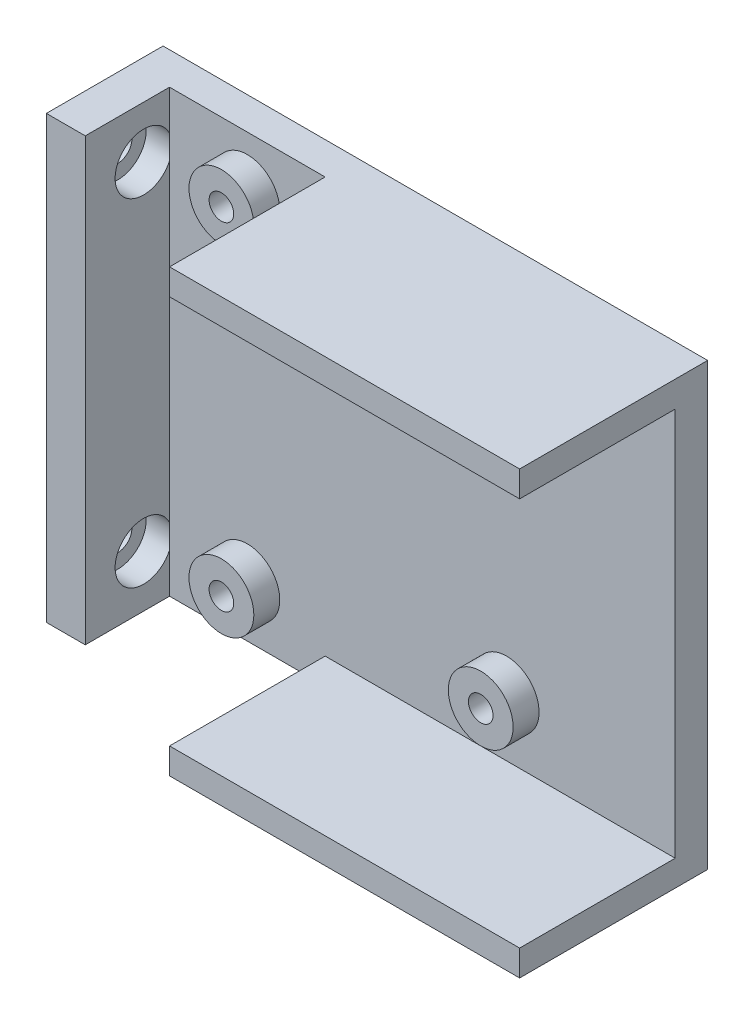
ISO-10303-21;
HEADER;
FILE_DESCRIPTION(('STEP AP214'),'2;1');
FILE_NAME('part.step','',(''),(''),'','','');
FILE_SCHEMA(('AUTOMOTIVE_DESIGN { 1 0 10303 214 1 1 1 1 }'));
ENDSEC;
DATA;
#1=APPLICATION_CONTEXT('core data for automotive mechanical design processes');
#2=APPLICATION_PROTOCOL_DEFINITION('international standard','automotive_design',2000,#1);
#3=PRODUCT_CONTEXT('',#1,'mechanical');
#4=PRODUCT('Part','Part','',(#3));
#5=PRODUCT_RELATED_PRODUCT_CATEGORY('part','',(#4));
#6=PRODUCT_DEFINITION_FORMATION('','',#4);
#7=PRODUCT_DEFINITION_CONTEXT('part definition',#1,'design');
#8=PRODUCT_DEFINITION('design','',#6,#7);
#9=PRODUCT_DEFINITION_SHAPE('','',#8);
#10=(LENGTH_UNIT() NAMED_UNIT(*) SI_UNIT(.MILLI.,.METRE.));
#11=(NAMED_UNIT(*) PLANE_ANGLE_UNIT() SI_UNIT($,.RADIAN.));
#12=(NAMED_UNIT(*) SI_UNIT($,.STERADIAN.) SOLID_ANGLE_UNIT());
#13=UNCERTAINTY_MEASURE_WITH_UNIT(LENGTH_MEASURE(1.E-05),#10,'distance_accuracy_value','');
#14=(GEOMETRIC_REPRESENTATION_CONTEXT(3) GLOBAL_UNCERTAINTY_ASSIGNED_CONTEXT((#13)) GLOBAL_UNIT_ASSIGNED_CONTEXT((#10,
#11,#12)) REPRESENTATION_CONTEXT('',''));
#15=CARTESIAN_POINT('',(0.,0.,0.));
#16=DIRECTION('',(0.,0.,1.));
#17=DIRECTION('',(1.,0.,0.));
#18=AXIS2_PLACEMENT_3D('',#15,#16,#17);
#19=CARTESIAN_POINT('',(0.,0.,14.5));
#20=DIRECTION('',(0.,0.,-1.));
#21=DIRECTION('',(-1.,0.,0.));
#22=AXIS2_PLACEMENT_3D('',#19,#20,#21);
#23=PLANE('',#22);
#24=DIRECTION('',(-1.,0.,0.));
#25=VECTOR('',#24,1.);
#26=CARTESIAN_POINT('',(3.,2.,14.5));
#27=LINE('',#26,#25);
#28=CARTESIAN_POINT('',(42.,2.,14.5));
#29=VERTEX_POINT('',#28);
#30=CARTESIAN_POINT('',(15.,2.,14.5));
#31=VERTEX_POINT('',#30);
#32=EDGE_CURVE('E299',#29,#31,#27,.T.);
#33=ORIENTED_EDGE('',*,*,#32,.T.);
#34=DIRECTION('',(0.,1.,0.));
#35=VECTOR('',#34,1.);
#36=CARTESIAN_POINT('',(15.,0.,14.5));
#37=LINE('',#36,#35);
#38=CARTESIAN_POINT('',(15.,0.,14.5));
#39=VERTEX_POINT('',#38);
#40=EDGE_CURVE('E275',#39,#31,#37,.T.);
#41=ORIENTED_EDGE('',*,*,#40,.F.);
#42=DIRECTION('',(1.,0.,0.));
#43=VECTOR('',#42,1.);
#44=CARTESIAN_POINT('',(42.,0.,14.5));
#45=LINE('',#44,#43);
#46=CARTESIAN_POINT('',(42.,0.,14.5));
#47=VERTEX_POINT('',#46);
#48=EDGE_CURVE('E202',#39,#47,#45,.T.);
#49=ORIENTED_EDGE('',*,*,#48,.T.);
#50=DIRECTION('',(0.,1.,0.));
#51=VECTOR('',#50,1.);
#52=CARTESIAN_POINT('',(42.,2.,14.5));
#53=LINE('',#52,#51);
#54=EDGE_CURVE('E205',#47,#29,#53,.T.);
#55=ORIENTED_EDGE('',*,*,#54,.T.);
#56=EDGE_LOOP('',(#33,#41,#49,#55));
#57=FACE_BOUND('',#56,.T.);
#58=ADVANCED_FACE('F35',(#57),#23,.F.);
#59=DIRECTION('',(-1.,0.,0.));
#60=VECTOR('',#59,1.);
#61=CARTESIAN_POINT('',(0.,34.,14.5));
#62=LINE('',#61,#60);
#63=CARTESIAN_POINT('',(42.,34.,14.5));
#64=VERTEX_POINT('',#63);
#65=CARTESIAN_POINT('',(15.,34.,14.5));
#66=VERTEX_POINT('',#65);
#67=EDGE_CURVE('E216',#64,#66,#62,.T.);
#68=ORIENTED_EDGE('',*,*,#67,.T.);
#69=DIRECTION('',(0.,-1.,0.));
#70=VECTOR('',#69,1.);
#71=CARTESIAN_POINT('',(15.,0.,14.5));
#72=LINE('',#71,#70);
#73=CARTESIAN_POINT('',(15.,32.,14.5));
#74=VERTEX_POINT('',#73);
#75=EDGE_CURVE('E169',#66,#74,#72,.T.);
#76=ORIENTED_EDGE('',*,*,#75,.T.);
#77=DIRECTION('',(1.,0.,0.));
#78=VECTOR('',#77,1.);
#79=CARTESIAN_POINT('',(42.,32.,14.5));
#80=LINE('',#79,#78);
#81=CARTESIAN_POINT('',(42.,32.,14.5));
#82=VERTEX_POINT('',#81);
#83=EDGE_CURVE('E302',#74,#82,#80,.T.);
#84=ORIENTED_EDGE('',*,*,#83,.T.);
#85=DIRECTION('',(0.,1.,0.));
#86=VECTOR('',#85,1.);
#87=CARTESIAN_POINT('',(42.,34.,14.5));
#88=LINE('',#87,#86);
#89=EDGE_CURVE('E304',#82,#64,#88,.T.);
#90=ORIENTED_EDGE('',*,*,#89,.T.);
#91=EDGE_LOOP('',(#68,#76,#84,#90));
#92=FACE_BOUND('',#91,.T.);
#93=ADVANCED_FACE('F185',(#92),#23,.F.);
#94=CARTESIAN_POINT('',(0.,0.,2.5));
#95=DIRECTION('',(0.,0.,-1.));
#96=DIRECTION('',(-1.,0.,0.));
#97=AXIS2_PLACEMENT_3D('',#94,#95,#96);
#98=PLANE('',#97);
#99=CARTESIAN_POINT('',(29.,6.5,2.5));
#100=DIRECTION('',(0.,0.,-1.));
#101=DIRECTION('',(-1.,0.,0.));
#102=AXIS2_PLACEMENT_3D('',#99,#100,#101);
#103=CIRCLE('',#102,2.5);
#104=CARTESIAN_POINT('',(26.5,6.5,2.5));
#105=VERTEX_POINT('',#104);
#106=EDGE_CURVE('E12',#105,#105,#103,.F.);
#107=ORIENTED_EDGE('',*,*,#106,.F.);
#108=EDGE_LOOP('',(#107));
#109=FACE_BOUND('',#108,.T.);
#110=CARTESIAN_POINT('',(29.,27.5,2.5));
#111=DIRECTION('',(0.,0.,-1.));
#112=DIRECTION('',(-1.,0.,0.));
#113=AXIS2_PLACEMENT_3D('',#110,#111,#112);
#114=CIRCLE('',#113,2.5);
#115=CARTESIAN_POINT('',(26.5,27.5,2.5));
#116=VERTEX_POINT('',#115);
#117=EDGE_CURVE('E43',#116,#116,#114,.F.);
#118=ORIENTED_EDGE('',*,*,#117,.F.);
#119=EDGE_LOOP('',(#118));
#120=FACE_BOUND('',#119,.T.);
#121=CARTESIAN_POINT('',(9.00000000000001,4.,2.5));
#122=DIRECTION('',(0.,0.,-1.));
#123=DIRECTION('',(-1.,0.,0.));
#124=AXIS2_PLACEMENT_3D('',#121,#122,#123);
#125=CIRCLE('',#124,2.5);
#126=CARTESIAN_POINT('',(6.5,4.,2.5));
#127=VERTEX_POINT('',#126);
#128=EDGE_CURVE('E175',#127,#127,#125,.F.);
#129=ORIENTED_EDGE('',*,*,#128,.F.);
#130=EDGE_LOOP('',(#129));
#131=FACE_BOUND('',#130,.T.);
#132=CARTESIAN_POINT('',(9.,30.,2.5));
#133=DIRECTION('',(0.,0.,-1.));
#134=DIRECTION('',(-1.,0.,0.));
#135=AXIS2_PLACEMENT_3D('',#132,#133,#134);
#136=CIRCLE('',#135,2.5);
#137=CARTESIAN_POINT('',(6.5,30.,2.5));
#138=VERTEX_POINT('',#137);
#139=EDGE_CURVE('E172',#138,#138,#136,.F.);
#140=ORIENTED_EDGE('',*,*,#139,.F.);
#141=EDGE_LOOP('',(#140));
#142=FACE_BOUND('',#141,.T.);
#143=DIRECTION('',(1.,0.,0.));
#144=VECTOR('',#143,1.);
#145=CARTESIAN_POINT('',(42.,32.,2.5));
#146=LINE('',#145,#144);
#147=CARTESIAN_POINT('',(15.,32.,2.5));
#148=VERTEX_POINT('',#147);
#149=CARTESIAN_POINT('',(42.,32.,2.5));
#150=VERTEX_POINT('',#149);
#151=EDGE_CURVE('E193',#148,#150,#146,.T.);
#152=ORIENTED_EDGE('',*,*,#151,.F.);
#153=DIRECTION('',(0.,1.,0.));
#154=VECTOR('',#153,1.);
#155=CARTESIAN_POINT('',(15.,0.,2.5));
#156=LINE('',#155,#154);
#157=CARTESIAN_POINT('',(15.,34.,2.5));
#158=VERTEX_POINT('',#157);
#159=EDGE_CURVE('E195',#148,#158,#156,.T.);
#160=ORIENTED_EDGE('',*,*,#159,.T.);
#161=DIRECTION('',(-1.,0.,0.));
#162=VECTOR('',#161,1.);
#163=CARTESIAN_POINT('',(3.,34.,2.5));
#164=LINE('',#163,#162);
#165=CARTESIAN_POINT('',(3.,34.,2.5));
#166=VERTEX_POINT('',#165);
#167=EDGE_CURVE('E281',#158,#166,#164,.T.);
#168=ORIENTED_EDGE('',*,*,#167,.T.);
#169=DIRECTION('',(0.,1.,0.));
#170=VECTOR('',#169,1.);
#171=CARTESIAN_POINT('',(3.,32.,2.5));
#172=LINE('',#171,#170);
#173=CARTESIAN_POINT('',(3.,30.9165151389912,2.5));
#174=VERTEX_POINT('',#173);
#175=EDGE_CURVE('E210',#174,#166,#172,.T.);
#176=ORIENTED_EDGE('',*,*,#175,.F.);
#177=CARTESIAN_POINT('',(3.,29.0834848610088,2.5));
#178=VERTEX_POINT('',#177);
#179=EDGE_CURVE('E308',#178,#174,#172,.T.);
#180=ORIENTED_EDGE('',*,*,#179,.F.);
#181=CARTESIAN_POINT('',(3.,4.91651513899117,2.5));
#182=VERTEX_POINT('',#181);
#183=EDGE_CURVE('E312',#182,#178,#172,.T.);
#184=ORIENTED_EDGE('',*,*,#183,.F.);
#185=CARTESIAN_POINT('',(3.,3.08348486100883,2.5));
#186=VERTEX_POINT('',#185);
#187=EDGE_CURVE('E208',#186,#182,#172,.T.);
#188=ORIENTED_EDGE('',*,*,#187,.F.);
#189=CARTESIAN_POINT('',(3.,0.,2.5));
#190=VERTEX_POINT('',#189);
#191=EDGE_CURVE('E203',#190,#186,#172,.T.);
#192=ORIENTED_EDGE('',*,*,#191,.F.);
#193=DIRECTION('',(1.,0.,0.));
#194=VECTOR('',#193,1.);
#195=CARTESIAN_POINT('',(3.,0.,2.5));
#196=LINE('',#195,#194);
#197=CARTESIAN_POINT('',(15.,0.,2.5));
#198=VERTEX_POINT('',#197);
#199=EDGE_CURVE('E277',#190,#198,#196,.T.);
#200=ORIENTED_EDGE('',*,*,#199,.T.);
#201=CARTESIAN_POINT('',(15.,2.,2.5));
#202=VERTEX_POINT('',#201);
#203=EDGE_CURVE('E285',#198,#202,#156,.T.);
#204=ORIENTED_EDGE('',*,*,#203,.T.);
#205=DIRECTION('',(-1.,0.,0.));
#206=VECTOR('',#205,1.);
#207=CARTESIAN_POINT('',(3.,2.,2.5));
#208=LINE('',#207,#206);
#209=CARTESIAN_POINT('',(42.,2.,2.5));
#210=VERTEX_POINT('',#209);
#211=EDGE_CURVE('E296',#210,#202,#208,.T.);
#212=ORIENTED_EDGE('',*,*,#211,.F.);
#213=DIRECTION('',(0.,1.,0.));
#214=VECTOR('',#213,1.);
#215=CARTESIAN_POINT('',(42.,0.,2.5));
#216=LINE('',#215,#214);
#217=EDGE_CURVE('E157',#210,#150,#216,.T.);
#218=ORIENTED_EDGE('',*,*,#217,.T.);
#219=EDGE_LOOP('',(#152,#160,#168,#176,#180,#184,#188,#192,#200,#204,#212,#218));
#220=FACE_BOUND('',#219,.T.);
#221=ADVANCED_FACE('F182',(#109,#120,#131,#142,#220),#98,.F.);
#222=CARTESIAN_POINT('',(0.,0.,2.5));
#223=DIRECTION('',(1.,0.,0.));
#224=DIRECTION('',(0.,0.,-1.));
#225=AXIS2_PLACEMENT_3D('',#222,#223,#224);
#226=PLANE('',#225);
#227=CARTESIAN_POINT('',(0.,30.,4.5));
#228=DIRECTION('',(1.,0.,0.));
#229=DIRECTION('',(0.,0.,-1.));
#230=AXIS2_PLACEMENT_3D('',#227,#228,#229);
#231=CIRCLE('',#230,1.1);
#232=CARTESIAN_POINT('',(0.,30.,3.4));
#233=VERTEX_POINT('',#232);
#234=EDGE_CURVE('E259',#233,#233,#231,.T.);
#235=ORIENTED_EDGE('',*,*,#234,.T.);
#236=EDGE_LOOP('',(#235));
#237=FACE_BOUND('',#236,.T.);
#238=CARTESIAN_POINT('',(0.,4.,4.5));
#239=DIRECTION('',(1.,0.,0.));
#240=DIRECTION('',(0.,0.,-1.));
#241=AXIS2_PLACEMENT_3D('',#238,#239,#240);
#242=CIRCLE('',#241,1.1);
#243=CARTESIAN_POINT('',(0.,4.,3.4));
#244=VERTEX_POINT('',#243);
#245=EDGE_CURVE('E272',#244,#244,#242,.T.);
#246=ORIENTED_EDGE('',*,*,#245,.T.);
#247=EDGE_LOOP('',(#246));
#248=FACE_BOUND('',#247,.T.);
#249=DIRECTION('',(0.,0.,-1.));
#250=VECTOR('',#249,1.);
#251=CARTESIAN_POINT('',(0.,0.,2.5));
#252=LINE('',#251,#250);
#253=CARTESIAN_POINT('',(0.,0.,9.));
#254=VERTEX_POINT('',#253);
#255=CARTESIAN_POINT('',(0.,0.,0.));
#256=VERTEX_POINT('',#255);
#257=EDGE_CURVE('E149',#254,#256,#252,.T.);
#258=ORIENTED_EDGE('',*,*,#257,.F.);
#259=DIRECTION('',(0.,-1.,0.));
#260=VECTOR('',#259,1.);
#261=CARTESIAN_POINT('',(0.,34.,9.));
#262=LINE('',#261,#260);
#263=CARTESIAN_POINT('',(0.,34.,9.));
#264=VERTEX_POINT('',#263);
#265=EDGE_CURVE('E137',#264,#254,#262,.T.);
#266=ORIENTED_EDGE('',*,*,#265,.F.);
#267=DIRECTION('',(0.,0.,-1.));
#268=VECTOR('',#267,1.);
#269=CARTESIAN_POINT('',(0.,34.,2.5));
#270=LINE('',#269,#268);
#271=CARTESIAN_POINT('',(0.,34.,0.));
#272=VERTEX_POINT('',#271);
#273=EDGE_CURVE('E147',#264,#272,#270,.T.);
#274=ORIENTED_EDGE('',*,*,#273,.T.);
#275=DIRECTION('',(0.,-1.,0.));
#276=VECTOR('',#275,1.);
#277=CARTESIAN_POINT('',(0.,0.,0.));
#278=LINE('',#277,#276);
#279=EDGE_CURVE('E218',#272,#256,#278,.T.);
#280=ORIENTED_EDGE('',*,*,#279,.T.);
#281=EDGE_LOOP('',(#258,#266,#274,#280));
#282=FACE_BOUND('',#281,.T.);
#283=ADVANCED_FACE('F37',(#237,#248,#282),#226,.F.);
#284=CARTESIAN_POINT('',(0.,0.,2.5));
#285=DIRECTION('',(0.,1.,0.));
#286=DIRECTION('',(0.,0.,1.));
#287=AXIS2_PLACEMENT_3D('',#284,#285,#286);
#288=PLANE('',#287);
#289=DIRECTION('',(0.,0.,1.));
#290=VECTOR('',#289,1.);
#291=CARTESIAN_POINT('',(3.,0.,-33.5555127546399));
#292=LINE('',#291,#290);
#293=CARTESIAN_POINT('',(3.,0.,9.));
#294=VERTEX_POINT('',#293);
#295=EDGE_CURVE('E242',#190,#294,#292,.T.);
#296=ORIENTED_EDGE('',*,*,#295,.T.);
#297=DIRECTION('',(1.,0.,0.));
#298=VECTOR('',#297,1.);
#299=CARTESIAN_POINT('',(0.,0.,9.));
#300=LINE('',#299,#298);
#301=EDGE_CURVE('E50',#254,#294,#300,.T.);
#302=ORIENTED_EDGE('',*,*,#301,.F.);
#303=ORIENTED_EDGE('',*,*,#257,.T.);
#304=DIRECTION('',(1.,0.,0.));
#305=VECTOR('',#304,1.);
#306=CARTESIAN_POINT('',(0.,0.,0.));
#307=LINE('',#306,#305);
#308=CARTESIAN_POINT('',(42.,0.,0.));
#309=VERTEX_POINT('',#308);
#310=EDGE_CURVE('E221',#256,#309,#307,.T.);
#311=ORIENTED_EDGE('',*,*,#310,.T.);
#312=DIRECTION('',(0.,0.,-1.));
#313=VECTOR('',#312,1.);
#314=CARTESIAN_POINT('',(42.,0.,2.5));
#315=LINE('',#314,#313);
#316=EDGE_CURVE('E159',#47,#309,#315,.T.);
#317=ORIENTED_EDGE('',*,*,#316,.F.);
#318=ORIENTED_EDGE('',*,*,#48,.F.);
#319=DIRECTION('',(0.,0.,1.));
#320=VECTOR('',#319,1.);
#321=CARTESIAN_POINT('',(15.,0.,-33.5555127546399));
#322=LINE('',#321,#320);
#323=EDGE_CURVE('E280',#198,#39,#322,.T.);
#324=ORIENTED_EDGE('',*,*,#323,.F.);
#325=ORIENTED_EDGE('',*,*,#199,.F.);
#326=EDGE_LOOP('',(#296,#302,#303,#311,#317,#318,#324,#325));
#327=FACE_BOUND('',#326,.T.);
#328=ADVANCED_FACE('F238',(#327),#288,.F.);
#329=CARTESIAN_POINT('',(42.,0.,2.5));
#330=DIRECTION('',(-1.,0.,0.));
#331=DIRECTION('',(0.,0.,1.));
#332=AXIS2_PLACEMENT_3D('',#329,#330,#331);
#333=PLANE('',#332);
#334=DIRECTION('',(0.,1.,0.));
#335=VECTOR('',#334,1.);
#336=CARTESIAN_POINT('',(42.,0.,0.));
#337=LINE('',#336,#335);
#338=CARTESIAN_POINT('',(42.,34.,0.));
#339=VERTEX_POINT('',#338);
#340=EDGE_CURVE('E222',#309,#339,#337,.T.);
#341=ORIENTED_EDGE('',*,*,#340,.T.);
#342=DIRECTION('',(0.,0.,-1.));
#343=VECTOR('',#342,1.);
#344=CARTESIAN_POINT('',(42.,34.,2.5));
#345=LINE('',#344,#343);
#346=EDGE_CURVE('E156',#64,#339,#345,.T.);
#347=ORIENTED_EDGE('',*,*,#346,.F.);
#348=ORIENTED_EDGE('',*,*,#89,.F.);
#349=DIRECTION('',(0.,0.,-1.));
#350=VECTOR('',#349,1.);
#351=CARTESIAN_POINT('',(42.,32.,14.5));
#352=LINE('',#351,#350);
#353=EDGE_CURVE('E213',#82,#150,#352,.T.);
#354=ORIENTED_EDGE('',*,*,#353,.T.);
#355=ORIENTED_EDGE('',*,*,#217,.F.);
#356=DIRECTION('',(0.,0.,-1.));
#357=VECTOR('',#356,1.);
#358=CARTESIAN_POINT('',(42.,2.,14.5));
#359=LINE('',#358,#357);
#360=EDGE_CURVE('E215',#29,#210,#359,.T.);
#361=ORIENTED_EDGE('',*,*,#360,.F.);
#362=ORIENTED_EDGE('',*,*,#54,.F.);
#363=ORIENTED_EDGE('',*,*,#316,.T.);
#364=EDGE_LOOP('',(#341,#347,#348,#354,#355,#361,#362,#363));
#365=FACE_BOUND('',#364,.T.);
#366=ADVANCED_FACE('F225',(#365),#333,.F.);
#367=CARTESIAN_POINT('',(0.,34.,2.5));
#368=DIRECTION('',(0.,-1.,0.));
#369=DIRECTION('',(0.,0.,-1.));
#370=AXIS2_PLACEMENT_3D('',#367,#368,#369);
#371=PLANE('',#370);
#372=ORIENTED_EDGE('',*,*,#273,.F.);
#373=DIRECTION('',(-1.,0.,0.));
#374=VECTOR('',#373,1.);
#375=CARTESIAN_POINT('',(3.,34.,9.));
#376=LINE('',#375,#374);
#377=CARTESIAN_POINT('',(3.,34.,9.));
#378=VERTEX_POINT('',#377);
#379=EDGE_CURVE('E134',#378,#264,#376,.T.);
#380=ORIENTED_EDGE('',*,*,#379,.F.);
#381=DIRECTION('',(0.,0.,1.));
#382=VECTOR('',#381,1.);
#383=CARTESIAN_POINT('',(3.,34.,-33.5555127546399));
#384=LINE('',#383,#382);
#385=EDGE_CURVE('E283',#166,#378,#384,.T.);
#386=ORIENTED_EDGE('',*,*,#385,.F.);
#387=ORIENTED_EDGE('',*,*,#167,.F.);
#388=DIRECTION('',(0.,0.,1.));
#389=VECTOR('',#388,1.);
#390=CARTESIAN_POINT('',(15.,34.,-33.5555127546399));
#391=LINE('',#390,#389);
#392=EDGE_CURVE('E284',#158,#66,#391,.T.);
#393=ORIENTED_EDGE('',*,*,#392,.T.);
#394=ORIENTED_EDGE('',*,*,#67,.F.);
#395=ORIENTED_EDGE('',*,*,#346,.T.);
#396=DIRECTION('',(-1.,0.,0.));
#397=VECTOR('',#396,1.);
#398=CARTESIAN_POINT('',(0.,34.,0.));
#399=LINE('',#398,#397);
#400=EDGE_CURVE('E154',#339,#272,#399,.T.);
#401=ORIENTED_EDGE('',*,*,#400,.T.);
#402=EDGE_LOOP('',(#372,#380,#386,#387,#393,#394,#395,#401));
#403=FACE_BOUND('',#402,.T.);
#404=ADVANCED_FACE('F151',(#403),#371,.F.);
#405=CARTESIAN_POINT('',(0.,0.,0.));
#406=DIRECTION('',(0.,0.,-1.));
#407=DIRECTION('',(-1.,0.,0.));
#408=AXIS2_PLACEMENT_3D('',#405,#406,#407);
#409=PLANE('',#408);
#410=CARTESIAN_POINT('',(9.,30.,0.));
#411=DIRECTION('',(0.,0.,-1.));
#412=DIRECTION('',(-1.,0.,0.));
#413=AXIS2_PLACEMENT_3D('',#410,#411,#412);
#414=CIRCLE('',#413,0.949999999999999);
#415=CARTESIAN_POINT('',(8.05,30.,0.));
#416=VERTEX_POINT('',#415);
#417=EDGE_CURVE('E625',#416,#416,#414,.F.);
#418=ORIENTED_EDGE('',*,*,#417,.T.);
#419=EDGE_LOOP('',(#418));
#420=FACE_BOUND('',#419,.T.);
#421=CARTESIAN_POINT('',(29.,6.5,0.));
#422=DIRECTION('',(0.,0.,-1.));
#423=DIRECTION('',(-1.,0.,0.));
#424=AXIS2_PLACEMENT_3D('',#421,#422,#423);
#425=CIRCLE('',#424,0.950000000000001);
#426=CARTESIAN_POINT('',(28.05,6.5,0.));
#427=VERTEX_POINT('',#426);
#428=EDGE_CURVE('E637',#427,#427,#425,.F.);
#429=ORIENTED_EDGE('',*,*,#428,.T.);
#430=EDGE_LOOP('',(#429));
#431=FACE_BOUND('',#430,.T.);
#432=CARTESIAN_POINT('',(29.,27.5,0.));
#433=DIRECTION('',(0.,0.,-1.));
#434=DIRECTION('',(-1.,0.,0.));
#435=AXIS2_PLACEMENT_3D('',#432,#433,#434);
#436=CIRCLE('',#435,0.950000000000001);
#437=CARTESIAN_POINT('',(28.05,27.5,0.));
#438=VERTEX_POINT('',#437);
#439=EDGE_CURVE('E644',#438,#438,#436,.F.);
#440=ORIENTED_EDGE('',*,*,#439,.T.);
#441=EDGE_LOOP('',(#440));
#442=FACE_BOUND('',#441,.T.);
#443=CARTESIAN_POINT('',(9.00000000000001,4.,0.));
#444=DIRECTION('',(0.,0.,-1.));
#445=DIRECTION('',(-1.,0.,0.));
#446=AXIS2_PLACEMENT_3D('',#443,#444,#445);
#447=CIRCLE('',#446,0.949999999999999);
#448=CARTESIAN_POINT('',(8.05,4.,0.));
#449=VERTEX_POINT('',#448);
#450=EDGE_CURVE('E631',#449,#449,#447,.F.);
#451=ORIENTED_EDGE('',*,*,#450,.T.);
#452=EDGE_LOOP('',(#451));
#453=FACE_BOUND('',#452,.T.);
#454=ORIENTED_EDGE('',*,*,#279,.F.);
#455=ORIENTED_EDGE('',*,*,#400,.F.);
#456=ORIENTED_EDGE('',*,*,#340,.F.);
#457=ORIENTED_EDGE('',*,*,#310,.F.);
#458=EDGE_LOOP('',(#454,#455,#456,#457));
#459=FACE_BOUND('',#458,.T.);
#460=ADVANCED_FACE('F235',(#420,#431,#442,#453,#459),#409,.T.);
#461=CARTESIAN_POINT('',(3.,2.,14.5));
#462=DIRECTION('',(0.,-1.,0.));
#463=DIRECTION('',(0.,0.,-1.));
#464=AXIS2_PLACEMENT_3D('',#461,#462,#463);
#465=PLANE('',#464);
#466=ORIENTED_EDGE('',*,*,#211,.T.);
#467=DIRECTION('',(0.,0.,1.));
#468=VECTOR('',#467,1.);
#469=CARTESIAN_POINT('',(15.,2.,14.5));
#470=LINE('',#469,#468);
#471=EDGE_CURVE('E294',#202,#31,#470,.T.);
#472=ORIENTED_EDGE('',*,*,#471,.T.);
#473=ORIENTED_EDGE('',*,*,#32,.F.);
#474=ORIENTED_EDGE('',*,*,#360,.T.);
#475=EDGE_LOOP('',(#466,#472,#473,#474));
#476=FACE_BOUND('',#475,.T.);
#477=ADVANCED_FACE('F330',(#476),#465,.F.);
#478=CARTESIAN_POINT('',(3.,32.,14.5));
#479=DIRECTION('',(-1.,0.,0.));
#480=DIRECTION('',(0.,-1.,0.));
#481=AXIS2_PLACEMENT_3D('',#478,#479,#480);
#482=PLANE('',#481);
#483=ORIENTED_EDGE('',*,*,#385,.T.);
#484=DIRECTION('',(0.,1.,0.));
#485=VECTOR('',#484,1.);
#486=CARTESIAN_POINT('',(3.,0.,9.));
#487=LINE('',#486,#485);
#488=EDGE_CURVE('E138',#294,#378,#487,.T.);
#489=ORIENTED_EDGE('',*,*,#488,.F.);
#490=ORIENTED_EDGE('',*,*,#295,.F.);
#491=ORIENTED_EDGE('',*,*,#191,.T.);
#492=CARTESIAN_POINT('',(3.,4.,4.5));
#493=DIRECTION('',(1.,0.,0.));
#494=DIRECTION('',(0.,0.,-1.));
#495=AXIS2_PLACEMENT_3D('',#492,#493,#494);
#496=CIRCLE('',#495,2.2);
#497=EDGE_CURVE('E263',#182,#186,#496,.T.);
#498=ORIENTED_EDGE('',*,*,#497,.F.);
#499=ORIENTED_EDGE('',*,*,#183,.T.);
#500=CARTESIAN_POINT('',(3.,30.,4.5));
#501=DIRECTION('',(1.,0.,0.));
#502=DIRECTION('',(0.,0.,-1.));
#503=AXIS2_PLACEMENT_3D('',#500,#501,#502);
#504=CIRCLE('',#503,2.2);
#505=EDGE_CURVE('E251',#174,#178,#504,.T.);
#506=ORIENTED_EDGE('',*,*,#505,.F.);
#507=ORIENTED_EDGE('',*,*,#175,.T.);
#508=EDGE_LOOP('',(#483,#489,#490,#491,#498,#499,#506,#507));
#509=FACE_BOUND('',#508,.T.);
#510=ADVANCED_FACE('F322',(#509),#482,.F.);
#511=CARTESIAN_POINT('',(42.,32.,14.5));
#512=DIRECTION('',(0.,1.,0.));
#513=DIRECTION('',(-1.,0.,0.));
#514=AXIS2_PLACEMENT_3D('',#511,#512,#513);
#515=PLANE('',#514);
#516=ORIENTED_EDGE('',*,*,#83,.F.);
#517=DIRECTION('',(0.,0.,-1.));
#518=VECTOR('',#517,1.);
#519=CARTESIAN_POINT('',(15.,32.,14.5));
#520=LINE('',#519,#518);
#521=EDGE_CURVE('E292',#74,#148,#520,.T.);
#522=ORIENTED_EDGE('',*,*,#521,.T.);
#523=ORIENTED_EDGE('',*,*,#151,.T.);
#524=ORIENTED_EDGE('',*,*,#353,.F.);
#525=EDGE_LOOP('',(#516,#522,#523,#524));
#526=FACE_BOUND('',#525,.T.);
#527=ADVANCED_FACE('F334',(#526),#515,.F.);
#528=CARTESIAN_POINT('',(15.,0.,-33.5555127546399));
#529=DIRECTION('',(1.,0.,0.));
#530=DIRECTION('',(0.,0.,-1.));
#531=AXIS2_PLACEMENT_3D('',#528,#529,#530);
#532=PLANE('',#531);
#533=ORIENTED_EDGE('',*,*,#75,.F.);
#534=ORIENTED_EDGE('',*,*,#392,.F.);
#535=ORIENTED_EDGE('',*,*,#159,.F.);
#536=ORIENTED_EDGE('',*,*,#521,.F.);
#537=EDGE_LOOP('',(#533,#534,#535,#536));
#538=FACE_BOUND('',#537,.T.);
#539=ADVANCED_FACE('F337',(#538),#532,.F.);
#540=ORIENTED_EDGE('',*,*,#203,.F.);
#541=ORIENTED_EDGE('',*,*,#323,.T.);
#542=ORIENTED_EDGE('',*,*,#40,.T.);
#543=ORIENTED_EDGE('',*,*,#471,.F.);
#544=EDGE_LOOP('',(#540,#541,#542,#543));
#545=FACE_BOUND('',#544,.T.);
#546=ADVANCED_FACE('F327',(#545),#532,.F.);
#547=CARTESIAN_POINT('',(3.,6.2,4.5));
#548=DIRECTION('',(1.,0.,0.));
#549=DIRECTION('',(0.,0.,-1.));
#550=AXIS2_PLACEMENT_3D('',#547,#548,#549);
#551=PLANE('',#550);
#552=ORIENTED_EDGE('',*,*,#187,.T.);
#553=EDGE_CURVE('E262',#186,#182,#496,.T.);
#554=ORIENTED_EDGE('',*,*,#553,.F.);
#555=EDGE_LOOP('',(#552,#554));
#556=FACE_BOUND('',#555,.T.);
#557=ADVANCED_FACE('F321',(#556),#551,.F.);
#558=CARTESIAN_POINT('',(3.,4.,4.5));
#559=DIRECTION('',(1.,0.,0.));
#560=DIRECTION('',(0.,0.,-1.));
#561=AXIS2_PLACEMENT_3D('',#558,#559,#560);
#562=CYLINDRICAL_SURFACE('',#561,1.1);
#563=ORIENTED_EDGE('',*,*,#245,.F.);
#564=EDGE_LOOP('',(#563));
#565=FACE_BOUND('',#564,.T.);
#566=CARTESIAN_POINT('',(1.,4.,4.5));
#567=DIRECTION('',(1.,0.,0.));
#568=DIRECTION('',(0.,0.,-1.));
#569=AXIS2_PLACEMENT_3D('',#566,#567,#568);
#570=CIRCLE('',#569,1.1);
#571=CARTESIAN_POINT('',(1.,4.,3.4));
#572=VERTEX_POINT('',#571);
#573=EDGE_CURVE('E269',#572,#572,#570,.T.);
#574=ORIENTED_EDGE('',*,*,#573,.T.);
#575=EDGE_LOOP('',(#574));
#576=FACE_BOUND('',#575,.T.);
#577=ADVANCED_FACE('F373',(#565,#576),#562,.F.);
#578=CARTESIAN_POINT('',(1.,5.1,4.5));
#579=DIRECTION('',(-1.,0.,0.));
#580=DIRECTION('',(0.,0.,1.));
#581=AXIS2_PLACEMENT_3D('',#578,#579,#580);
#582=PLANE('',#581);
#583=ORIENTED_EDGE('',*,*,#573,.F.);
#584=EDGE_LOOP('',(#583));
#585=FACE_BOUND('',#584,.T.);
#586=CARTESIAN_POINT('',(1.,4.,4.5));
#587=DIRECTION('',(1.,0.,0.));
#588=DIRECTION('',(0.,0.,-1.));
#589=AXIS2_PLACEMENT_3D('',#586,#587,#588);
#590=CIRCLE('',#589,2.2);
#591=CARTESIAN_POINT('',(1.,4.,2.3));
#592=VERTEX_POINT('',#591);
#593=EDGE_CURVE('E266',#592,#592,#590,.T.);
#594=ORIENTED_EDGE('',*,*,#593,.T.);
#595=EDGE_LOOP('',(#594));
#596=FACE_BOUND('',#595,.T.);
#597=ADVANCED_FACE('F376',(#585,#596),#582,.F.);
#598=CARTESIAN_POINT('',(3.,4.,4.5));
#599=DIRECTION('',(1.,0.,0.));
#600=DIRECTION('',(0.,0.,-1.));
#601=AXIS2_PLACEMENT_3D('',#598,#599,#600);
#602=CYLINDRICAL_SURFACE('',#601,2.2);
#603=ORIENTED_EDGE('',*,*,#593,.F.);
#604=EDGE_LOOP('',(#603));
#605=FACE_BOUND('',#604,.T.);
#606=ORIENTED_EDGE('',*,*,#497,.T.);
#607=ORIENTED_EDGE('',*,*,#553,.T.);
#608=EDGE_LOOP('',(#606,#607));
#609=FACE_BOUND('',#608,.T.);
#610=ADVANCED_FACE('F382',(#605,#609),#602,.F.);
#611=CARTESIAN_POINT('',(3.,32.2,4.5));
#612=DIRECTION('',(1.,0.,0.));
#613=DIRECTION('',(0.,0.,-1.));
#614=AXIS2_PLACEMENT_3D('',#611,#612,#613);
#615=PLANE('',#614);
#616=ORIENTED_EDGE('',*,*,#179,.T.);
#617=EDGE_CURVE('E57',#178,#174,#504,.T.);
#618=ORIENTED_EDGE('',*,*,#617,.F.);
#619=EDGE_LOOP('',(#616,#618));
#620=FACE_BOUND('',#619,.T.);
#621=ADVANCED_FACE('F387',(#620),#615,.F.);
#622=CARTESIAN_POINT('',(3.,30.,4.5));
#623=DIRECTION('',(1.,0.,0.));
#624=DIRECTION('',(0.,0.,-1.));
#625=AXIS2_PLACEMENT_3D('',#622,#623,#624);
#626=CYLINDRICAL_SURFACE('',#625,1.1);
#627=ORIENTED_EDGE('',*,*,#234,.F.);
#628=EDGE_LOOP('',(#627));
#629=FACE_BOUND('',#628,.T.);
#630=CARTESIAN_POINT('',(1.,30.,4.5));
#631=DIRECTION('',(1.,0.,0.));
#632=DIRECTION('',(0.,0.,-1.));
#633=AXIS2_PLACEMENT_3D('',#630,#631,#632);
#634=CIRCLE('',#633,1.1);
#635=CARTESIAN_POINT('',(1.,30.,3.4));
#636=VERTEX_POINT('',#635);
#637=EDGE_CURVE('E256',#636,#636,#634,.T.);
#638=ORIENTED_EDGE('',*,*,#637,.T.);
#639=EDGE_LOOP('',(#638));
#640=FACE_BOUND('',#639,.T.);
#641=ADVANCED_FACE('F392',(#629,#640),#626,.F.);
#642=CARTESIAN_POINT('',(1.,31.1,4.5));
#643=DIRECTION('',(-1.,0.,0.));
#644=DIRECTION('',(0.,0.,1.));
#645=AXIS2_PLACEMENT_3D('',#642,#643,#644);
#646=PLANE('',#645);
#647=ORIENTED_EDGE('',*,*,#637,.F.);
#648=EDGE_LOOP('',(#647));
#649=FACE_BOUND('',#648,.T.);
#650=CARTESIAN_POINT('',(1.,30.,4.5));
#651=DIRECTION('',(1.,0.,0.));
#652=DIRECTION('',(0.,0.,-1.));
#653=AXIS2_PLACEMENT_3D('',#650,#651,#652);
#654=CIRCLE('',#653,2.2);
#655=CARTESIAN_POINT('',(1.,30.,2.3));
#656=VERTEX_POINT('',#655);
#657=EDGE_CURVE('E253',#656,#656,#654,.T.);
#658=ORIENTED_EDGE('',*,*,#657,.T.);
#659=EDGE_LOOP('',(#658));
#660=FACE_BOUND('',#659,.T.);
#661=ADVANCED_FACE('F427',(#649,#660),#646,.F.);
#662=CARTESIAN_POINT('',(3.,30.,4.5));
#663=DIRECTION('',(1.,0.,0.));
#664=DIRECTION('',(0.,0.,-1.));
#665=AXIS2_PLACEMENT_3D('',#662,#663,#664);
#666=CYLINDRICAL_SURFACE('',#665,2.2);
#667=ORIENTED_EDGE('',*,*,#657,.F.);
#668=EDGE_LOOP('',(#667));
#669=FACE_BOUND('',#668,.T.);
#670=ORIENTED_EDGE('',*,*,#505,.T.);
#671=ORIENTED_EDGE('',*,*,#617,.T.);
#672=EDGE_LOOP('',(#670,#671));
#673=FACE_BOUND('',#672,.T.);
#674=ADVANCED_FACE('F436',(#669,#673),#666,.F.);
#675=CARTESIAN_POINT('',(0.,0.,9.));
#676=DIRECTION('',(0.,0.,-1.));
#677=DIRECTION('',(-1.,0.,0.));
#678=AXIS2_PLACEMENT_3D('',#675,#676,#677);
#679=PLANE('',#678);
#680=ORIENTED_EDGE('',*,*,#265,.T.);
#681=ORIENTED_EDGE('',*,*,#301,.T.);
#682=ORIENTED_EDGE('',*,*,#488,.T.);
#683=ORIENTED_EDGE('',*,*,#379,.T.);
#684=EDGE_LOOP('',(#680,#681,#682,#683));
#685=FACE_BOUND('',#684,.T.);
#686=ADVANCED_FACE('F136',(#685),#679,.F.);
#687=CARTESIAN_POINT('',(9.,30.,4.5));
#688=DIRECTION('',(0.,0.,-1.));
#689=DIRECTION('',(-1.,0.,0.));
#690=AXIS2_PLACEMENT_3D('',#687,#688,#689);
#691=CYLINDRICAL_SURFACE('',#690,2.5);
#692=CARTESIAN_POINT('',(9.,30.,4.5));
#693=DIRECTION('',(0.,0.,1.));
#694=DIRECTION('',(1.,0.,0.));
#695=AXIS2_PLACEMENT_3D('',#692,#693,#694);
#696=CIRCLE('',#695,2.5);
#697=CARTESIAN_POINT('',(11.5,30.,4.5));
#698=VERTEX_POINT('',#697);
#699=EDGE_CURVE('E243',#698,#698,#696,.T.);
#700=ORIENTED_EDGE('',*,*,#699,.F.);
#701=EDGE_LOOP('',(#700));
#702=FACE_BOUND('',#701,.T.);
#703=ORIENTED_EDGE('',*,*,#139,.T.);
#704=EDGE_LOOP('',(#703));
#705=FACE_BOUND('',#704,.T.);
#706=ADVANCED_FACE('F485',(#702,#705),#691,.T.);
#707=CARTESIAN_POINT('',(9.,30.,4.5));
#708=DIRECTION('',(0.,0.,1.));
#709=DIRECTION('',(1.,0.,0.));
#710=AXIS2_PLACEMENT_3D('',#707,#708,#709);
#711=PLANE('',#710);
#712=CARTESIAN_POINT('',(9.,30.,4.5));
#713=DIRECTION('',(0.,0.,1.));
#714=DIRECTION('',(1.,0.,0.));
#715=AXIS2_PLACEMENT_3D('',#712,#713,#714);
#716=CIRCLE('',#715,0.949999999999999);
#717=CARTESIAN_POINT('',(9.95,30.,4.5));
#718=VERTEX_POINT('',#717);
#719=EDGE_CURVE('E622',#718,#718,#716,.T.);
#720=ORIENTED_EDGE('',*,*,#719,.F.);
#721=EDGE_LOOP('',(#720));
#722=FACE_BOUND('',#721,.T.);
#723=ORIENTED_EDGE('',*,*,#699,.T.);
#724=EDGE_LOOP('',(#723));
#725=FACE_BOUND('',#724,.T.);
#726=ADVANCED_FACE('F500',(#722,#725),#711,.T.);
#727=CARTESIAN_POINT('',(9.00000000000001,4.,4.5));
#728=DIRECTION('',(0.,0.,-1.));
#729=DIRECTION('',(-1.,0.,0.));
#730=AXIS2_PLACEMENT_3D('',#727,#728,#729);
#731=CYLINDRICAL_SURFACE('',#730,2.5);
#732=CARTESIAN_POINT('',(9.00000000000001,4.,4.5));
#733=DIRECTION('',(0.,0.,1.));
#734=DIRECTION('',(1.,0.,0.));
#735=AXIS2_PLACEMENT_3D('',#732,#733,#734);
#736=CIRCLE('',#735,2.5);
#737=CARTESIAN_POINT('',(11.5,4.,4.5));
#738=VERTEX_POINT('',#737);
#739=EDGE_CURVE('E247',#738,#738,#736,.T.);
#740=ORIENTED_EDGE('',*,*,#739,.F.);
#741=EDGE_LOOP('',(#740));
#742=FACE_BOUND('',#741,.T.);
#743=ORIENTED_EDGE('',*,*,#128,.T.);
#744=EDGE_LOOP('',(#743));
#745=FACE_BOUND('',#744,.T.);
#746=ADVANCED_FACE('F508',(#742,#745),#731,.T.);
#747=CARTESIAN_POINT('',(9.00000000000001,4.,4.5));
#748=DIRECTION('',(0.,0.,1.));
#749=DIRECTION('',(1.,0.,0.));
#750=AXIS2_PLACEMENT_3D('',#747,#748,#749);
#751=PLANE('',#750);
#752=CARTESIAN_POINT('',(9.00000000000001,4.,4.5));
#753=DIRECTION('',(0.,0.,1.));
#754=DIRECTION('',(1.,0.,0.));
#755=AXIS2_PLACEMENT_3D('',#752,#753,#754);
#756=CIRCLE('',#755,0.949999999999999);
#757=CARTESIAN_POINT('',(9.95,4.,4.5));
#758=VERTEX_POINT('',#757);
#759=EDGE_CURVE('E641',#758,#758,#756,.T.);
#760=ORIENTED_EDGE('',*,*,#759,.F.);
#761=EDGE_LOOP('',(#760));
#762=FACE_BOUND('',#761,.T.);
#763=ORIENTED_EDGE('',*,*,#739,.T.);
#764=EDGE_LOOP('',(#763));
#765=FACE_BOUND('',#764,.T.);
#766=ADVANCED_FACE('F513',(#762,#765),#751,.T.);
#767=CARTESIAN_POINT('',(29.,27.5,4.5));
#768=DIRECTION('',(0.,0.,-1.));
#769=DIRECTION('',(-1.,0.,0.));
#770=AXIS2_PLACEMENT_3D('',#767,#768,#769);
#771=CYLINDRICAL_SURFACE('',#770,2.5);
#772=CARTESIAN_POINT('',(29.,27.5,4.5));
#773=DIRECTION('',(0.,0.,1.));
#774=DIRECTION('',(1.,0.,0.));
#775=AXIS2_PLACEMENT_3D('',#772,#773,#774);
#776=CIRCLE('',#775,2.5);
#777=CARTESIAN_POINT('',(31.5,27.5,4.5));
#778=VERTEX_POINT('',#777);
#779=EDGE_CURVE('E629',#778,#778,#776,.T.);
#780=ORIENTED_EDGE('',*,*,#779,.F.);
#781=EDGE_LOOP('',(#780));
#782=FACE_BOUND('',#781,.T.);
#783=ORIENTED_EDGE('',*,*,#117,.T.);
#784=EDGE_LOOP('',(#783));
#785=FACE_BOUND('',#784,.T.);
#786=ADVANCED_FACE('F180',(#782,#785),#771,.T.);
#787=CARTESIAN_POINT('',(29.,27.5,4.5));
#788=DIRECTION('',(0.,0.,1.));
#789=DIRECTION('',(1.,0.,0.));
#790=AXIS2_PLACEMENT_3D('',#787,#788,#789);
#791=PLANE('',#790);
#792=CARTESIAN_POINT('',(29.,27.5,4.5));
#793=DIRECTION('',(0.,0.,1.));
#794=DIRECTION('',(1.,0.,0.));
#795=AXIS2_PLACEMENT_3D('',#792,#793,#794);
#796=CIRCLE('',#795,0.950000000000001);
#797=CARTESIAN_POINT('',(29.95,27.5,4.5));
#798=VERTEX_POINT('',#797);
#799=EDGE_CURVE('E640',#798,#798,#796,.T.);
#800=ORIENTED_EDGE('',*,*,#799,.F.);
#801=EDGE_LOOP('',(#800));
#802=FACE_BOUND('',#801,.T.);
#803=ORIENTED_EDGE('',*,*,#779,.T.);
#804=EDGE_LOOP('',(#803));
#805=FACE_BOUND('',#804,.T.);
#806=ADVANCED_FACE('F525',(#802,#805),#791,.T.);
#807=CARTESIAN_POINT('',(29.,6.5,4.5));
#808=DIRECTION('',(0.,0.,-1.));
#809=DIRECTION('',(-1.,0.,0.));
#810=AXIS2_PLACEMENT_3D('',#807,#808,#809);
#811=CYLINDRICAL_SURFACE('',#810,2.5);
#812=CARTESIAN_POINT('',(29.,6.5,4.5));
#813=DIRECTION('',(0.,0.,1.));
#814=DIRECTION('',(-1.,0.,0.));
#815=AXIS2_PLACEMENT_3D('',#812,#813,#814);
#816=CIRCLE('',#815,2.5);
#817=CARTESIAN_POINT('',(26.5,6.5,4.5));
#818=VERTEX_POINT('',#817);
#819=EDGE_CURVE('E626',#818,#818,#816,.T.);
#820=ORIENTED_EDGE('',*,*,#819,.F.);
#821=EDGE_LOOP('',(#820));
#822=FACE_BOUND('',#821,.T.);
#823=ORIENTED_EDGE('',*,*,#106,.T.);
#824=EDGE_LOOP('',(#823));
#825=FACE_BOUND('',#824,.T.);
#826=ADVANCED_FACE('F533',(#822,#825),#811,.T.);
#827=CARTESIAN_POINT('',(29.,6.5,4.5));
#828=DIRECTION('',(0.,0.,-1.));
#829=DIRECTION('',(-1.,0.,0.));
#830=AXIS2_PLACEMENT_3D('',#827,#828,#829);
#831=PLANE('',#830);
#832=CARTESIAN_POINT('',(29.,6.5,4.5));
#833=DIRECTION('',(0.,0.,1.));
#834=DIRECTION('',(1.,0.,0.));
#835=AXIS2_PLACEMENT_3D('',#832,#833,#834);
#836=CIRCLE('',#835,0.950000000000001);
#837=CARTESIAN_POINT('',(29.95,6.5,4.5));
#838=VERTEX_POINT('',#837);
#839=EDGE_CURVE('E634',#838,#838,#836,.T.);
#840=ORIENTED_EDGE('',*,*,#839,.F.);
#841=EDGE_LOOP('',(#840));
#842=FACE_BOUND('',#841,.T.);
#843=ORIENTED_EDGE('',*,*,#819,.T.);
#844=EDGE_LOOP('',(#843));
#845=FACE_BOUND('',#844,.T.);
#846=ADVANCED_FACE('F538',(#842,#845),#831,.F.);
#847=CARTESIAN_POINT('',(29.,6.5,-2.68700576850888));
#848=DIRECTION('',(0.,0.,1.));
#849=DIRECTION('',(1.,0.,0.));
#850=AXIS2_PLACEMENT_3D('',#847,#848,#849);
#851=CYLINDRICAL_SURFACE('',#850,0.950000000000001);
#852=ORIENTED_EDGE('',*,*,#839,.T.);
#853=EDGE_LOOP('',(#852));
#854=FACE_BOUND('',#853,.T.);
#855=ORIENTED_EDGE('',*,*,#428,.F.);
#856=EDGE_LOOP('',(#855));
#857=FACE_BOUND('',#856,.T.);
#858=ADVANCED_FACE('F575',(#854,#857),#851,.F.);
#859=CARTESIAN_POINT('',(29.,27.5,-2.68700576850888));
#860=DIRECTION('',(0.,0.,1.));
#861=DIRECTION('',(1.,0.,0.));
#862=AXIS2_PLACEMENT_3D('',#859,#860,#861);
#863=CYLINDRICAL_SURFACE('',#862,0.950000000000001);
#864=ORIENTED_EDGE('',*,*,#799,.T.);
#865=EDGE_LOOP('',(#864));
#866=FACE_BOUND('',#865,.T.);
#867=ORIENTED_EDGE('',*,*,#439,.F.);
#868=EDGE_LOOP('',(#867));
#869=FACE_BOUND('',#868,.T.);
#870=ADVANCED_FACE('F585',(#866,#869),#863,.F.);
#871=CARTESIAN_POINT('',(9.00000000000001,4.,-2.68700576850888));
#872=DIRECTION('',(0.,0.,1.));
#873=DIRECTION('',(1.,0.,0.));
#874=AXIS2_PLACEMENT_3D('',#871,#872,#873);
#875=CYLINDRICAL_SURFACE('',#874,0.949999999999999);
#876=ORIENTED_EDGE('',*,*,#759,.T.);
#877=EDGE_LOOP('',(#876));
#878=FACE_BOUND('',#877,.T.);
#879=ORIENTED_EDGE('',*,*,#450,.F.);
#880=EDGE_LOOP('',(#879));
#881=FACE_BOUND('',#880,.T.);
#882=ADVANCED_FACE('F595',(#878,#881),#875,.F.);
#883=CARTESIAN_POINT('',(9.,30.,-2.68700576850888));
#884=DIRECTION('',(0.,0.,1.));
#885=DIRECTION('',(1.,0.,0.));
#886=AXIS2_PLACEMENT_3D('',#883,#884,#885);
#887=CYLINDRICAL_SURFACE('',#886,0.949999999999999);
#888=ORIENTED_EDGE('',*,*,#719,.T.);
#889=EDGE_LOOP('',(#888));
#890=FACE_BOUND('',#889,.T.);
#891=ORIENTED_EDGE('',*,*,#417,.F.);
#892=EDGE_LOOP('',(#891));
#893=FACE_BOUND('',#892,.T.);
#894=ADVANCED_FACE('F605',(#890,#893),#887,.F.);
#895=CLOSED_SHELL('',(#58,#93,#221,#283,#328,#366,#404,#460,#477,#510,#527,#539,#546,#557,#577,
#597,#610,#621,#641,#661,#674,#686,#706,#726,#746,#766,#786,#806,#826,#846,#858,#870,#882,#894));
#896=MANIFOLD_SOLID_BREP('B2',#895);
#897=ADVANCED_BREP_SHAPE_REPRESENTATION('',(#18,#896),#14);
#898=SHAPE_DEFINITION_REPRESENTATION(#9,#897);
ENDSEC;
END-ISO-10303-21;
